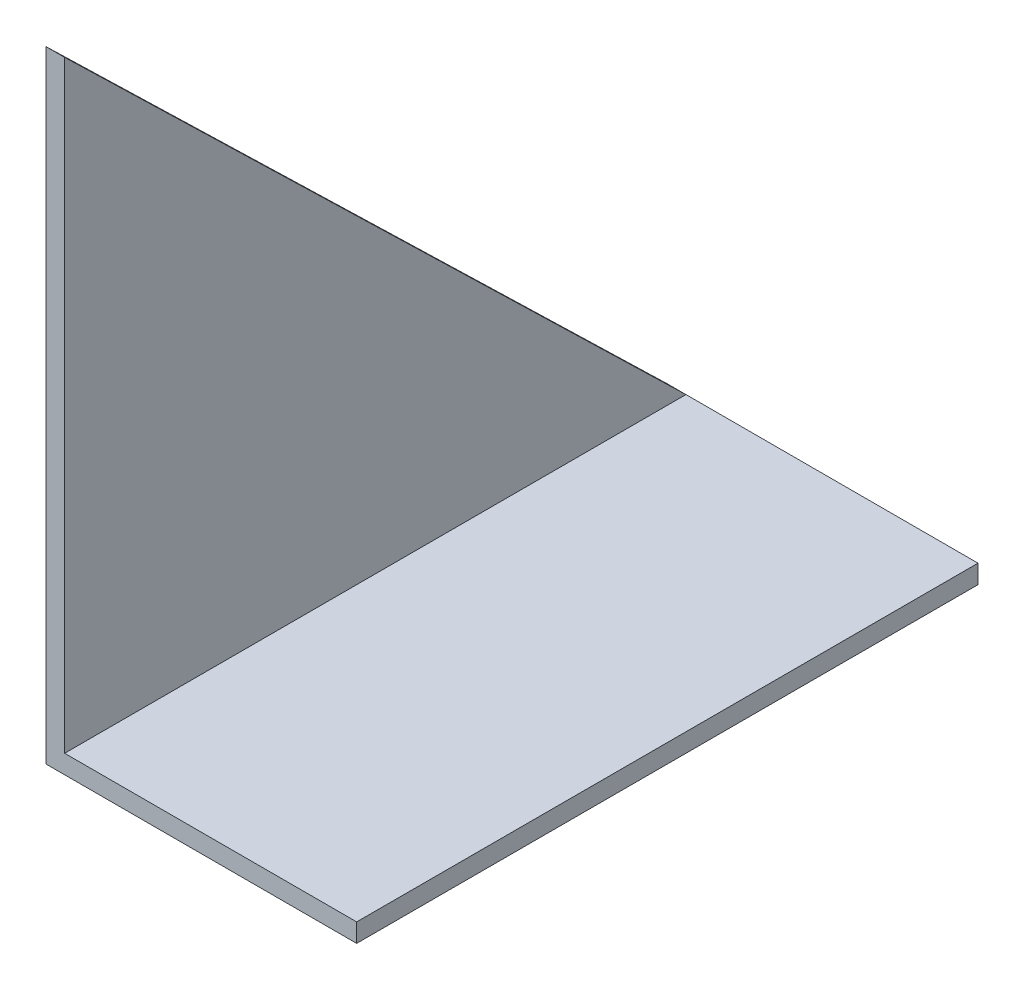
ISO-10303-21;
HEADER;
FILE_DESCRIPTION(('STEP AP214'),'2;1');
FILE_NAME('part.step','',(''),(''),'','','');
FILE_SCHEMA(('AUTOMOTIVE_DESIGN { 1 0 10303 214 1 1 1 1 }'));
ENDSEC;
DATA;
#1=APPLICATION_CONTEXT('core data for automotive mechanical design processes');
#2=APPLICATION_PROTOCOL_DEFINITION('international standard','automotive_design',2000,#1);
#3=PRODUCT_CONTEXT('',#1,'mechanical');
#4=PRODUCT('Part','Part','',(#3));
#5=PRODUCT_RELATED_PRODUCT_CATEGORY('part','',(#4));
#6=PRODUCT_DEFINITION_FORMATION('','',#4);
#7=PRODUCT_DEFINITION_CONTEXT('part definition',#1,'design');
#8=PRODUCT_DEFINITION('design','',#6,#7);
#9=PRODUCT_DEFINITION_SHAPE('','',#8);
#10=(LENGTH_UNIT() NAMED_UNIT(*) SI_UNIT(.MILLI.,.METRE.));
#11=(NAMED_UNIT(*) PLANE_ANGLE_UNIT() SI_UNIT($,.RADIAN.));
#12=(NAMED_UNIT(*) SI_UNIT($,.STERADIAN.) SOLID_ANGLE_UNIT());
#13=UNCERTAINTY_MEASURE_WITH_UNIT(LENGTH_MEASURE(1.E-05),#10,'distance_accuracy_value','');
#14=(GEOMETRIC_REPRESENTATION_CONTEXT(3) GLOBAL_UNCERTAINTY_ASSIGNED_CONTEXT((#13)) GLOBAL_UNIT_ASSIGNED_CONTEXT((#10,
#11,#12)) REPRESENTATION_CONTEXT('',''));
#15=CARTESIAN_POINT('',(0.,0.,0.));
#16=DIRECTION('',(0.,0.,1.));
#17=DIRECTION('',(1.,0.,0.));
#18=AXIS2_PLACEMENT_3D('',#15,#16,#17);
#19=CARTESIAN_POINT('',(-1.5,0.,50.));
#20=DIRECTION('',(-1.,0.,0.));
#21=DIRECTION('',(0.,0.,1.));
#22=AXIS2_PLACEMENT_3D('',#19,#20,#21);
#23=PLANE('',#22);
#24=DIRECTION('',(0.,0.696257929457928,0.717791679853534));
#25=VECTOR('',#24,1.);
#26=CARTESIAN_POINT('',(-1.5,25.7612447833479,25.0115925601525));
#27=LINE('',#26,#25);
#28=CARTESIAN_POINT('',(-1.5,-47.,-50.));
#29=VERTEX_POINT('',#28);
#30=CARTESIAN_POINT('',(-1.5,50.,50.));
#31=VERTEX_POINT('',#30);
#32=EDGE_CURVE('E101',#29,#31,#27,.T.);
#33=ORIENTED_EDGE('',*,*,#32,.F.);
#34=DIRECTION('',(0.,1.,0.));
#35=VECTOR('',#34,1.);
#36=CARTESIAN_POINT('',(-1.5,0.,-50.));
#37=LINE('',#36,#35);
#38=CARTESIAN_POINT('',(-1.5,-50.,-50.));
#39=VERTEX_POINT('',#38);
#40=EDGE_CURVE('E100',#39,#29,#37,.T.);
#41=ORIENTED_EDGE('',*,*,#40,.F.);
#42=DIRECTION('',(0.,0.,-1.));
#43=VECTOR('',#42,1.);
#44=CARTESIAN_POINT('',(-1.5,-50.,50.));
#45=LINE('',#44,#43);
#46=CARTESIAN_POINT('',(-1.5,-50.,50.));
#47=VERTEX_POINT('',#46);
#48=EDGE_CURVE('E44',#47,#39,#45,.T.);
#49=ORIENTED_EDGE('',*,*,#48,.F.);
#50=DIRECTION('',(0.,1.,0.));
#51=VECTOR('',#50,1.);
#52=CARTESIAN_POINT('',(-1.5,0.,50.));
#53=LINE('',#52,#51);
#54=EDGE_CURVE('E109',#47,#31,#53,.T.);
#55=ORIENTED_EDGE('',*,*,#54,.T.);
#56=EDGE_LOOP('',(#33,#41,#49,#55));
#57=FACE_BOUND('',#56,.T.);
#58=ADVANCED_FACE('F35',(#57),#23,.T.);
#59=CARTESIAN_POINT('',(0.,0.,-50.));
#60=DIRECTION('',(0.,0.,1.));
#61=DIRECTION('',(1.,0.,0.));
#62=AXIS2_PLACEMENT_3D('',#59,#60,#61);
#63=PLANE('',#62);
#64=ORIENTED_EDGE('',*,*,#40,.T.);
#65=DIRECTION('',(1.,0.,0.));
#66=VECTOR('',#65,1.);
#67=CARTESIAN_POINT('',(-98.5,-47.,-50.));
#68=LINE('',#67,#66);
#69=CARTESIAN_POINT('',(1.5,-47.,-50.));
#70=VERTEX_POINT('',#69);
#71=EDGE_CURVE('E77',#29,#70,#68,.T.);
#72=ORIENTED_EDGE('',*,*,#71,.T.);
#73=DIRECTION('',(1.,0.,0.));
#74=VECTOR('',#73,1.);
#75=CARTESIAN_POINT('',(1.5,-47.,-50.));
#76=LINE('',#75,#74);
#77=CARTESIAN_POINT('',(48.5,-47.,-50.));
#78=VERTEX_POINT('',#77);
#79=EDGE_CURVE('E118',#70,#78,#76,.T.);
#80=ORIENTED_EDGE('',*,*,#79,.T.);
#81=DIRECTION('',(0.,1.,0.));
#82=VECTOR('',#81,1.);
#83=CARTESIAN_POINT('',(48.5,-50.,-50.));
#84=LINE('',#83,#82);
#85=CARTESIAN_POINT('',(48.5,-50.,-50.));
#86=VERTEX_POINT('',#85);
#87=EDGE_CURVE('E108',#86,#78,#84,.T.);
#88=ORIENTED_EDGE('',*,*,#87,.F.);
#89=DIRECTION('',(-1.,0.,0.));
#90=VECTOR('',#89,1.);
#91=CARTESIAN_POINT('',(0.,-50.,-50.));
#92=LINE('',#91,#90);
#93=EDGE_CURVE('E94',#86,#39,#92,.T.);
#94=ORIENTED_EDGE('',*,*,#93,.T.);
#95=EDGE_LOOP('',(#64,#72,#80,#88,#94));
#96=FACE_BOUND('',#95,.T.);
#97=ADVANCED_FACE('F106',(#96),#63,.F.);
#98=CARTESIAN_POINT('',(0.,0.,50.));
#99=DIRECTION('',(0.,0.,1.));
#100=DIRECTION('',(1.,0.,0.));
#101=AXIS2_PLACEMENT_3D('',#98,#99,#100);
#102=PLANE('',#101);
#103=ORIENTED_EDGE('',*,*,#54,.F.);
#104=DIRECTION('',(-1.,0.,0.));
#105=VECTOR('',#104,1.);
#106=CARTESIAN_POINT('',(0.,-50.,50.));
#107=LINE('',#106,#105);
#108=CARTESIAN_POINT('',(48.5,-50.,50.));
#109=VERTEX_POINT('',#108);
#110=EDGE_CURVE('E96',#109,#47,#107,.T.);
#111=ORIENTED_EDGE('',*,*,#110,.F.);
#112=DIRECTION('',(0.,1.,0.));
#113=VECTOR('',#112,1.);
#114=CARTESIAN_POINT('',(48.5,-50.,50.));
#115=LINE('',#114,#113);
#116=CARTESIAN_POINT('',(48.5,-47.,50.));
#117=VERTEX_POINT('',#116);
#118=EDGE_CURVE('E116',#109,#117,#115,.T.);
#119=ORIENTED_EDGE('',*,*,#118,.T.);
#120=DIRECTION('',(1.,0.,0.));
#121=VECTOR('',#120,1.);
#122=CARTESIAN_POINT('',(1.5,-47.,50.));
#123=LINE('',#122,#121);
#124=CARTESIAN_POINT('',(1.5,-47.,50.));
#125=VERTEX_POINT('',#124);
#126=EDGE_CURVE('E114',#125,#117,#123,.T.);
#127=ORIENTED_EDGE('',*,*,#126,.F.);
#128=DIRECTION('',(0.,1.,0.));
#129=VECTOR('',#128,1.);
#130=CARTESIAN_POINT('',(1.5,0.,50.));
#131=LINE('',#130,#129);
#132=CARTESIAN_POINT('',(1.5,50.,50.));
#133=VERTEX_POINT('',#132);
#134=EDGE_CURVE('E129',#125,#133,#131,.T.);
#135=ORIENTED_EDGE('',*,*,#134,.T.);
#136=DIRECTION('',(-1.,0.,0.));
#137=VECTOR('',#136,1.);
#138=CARTESIAN_POINT('',(1.15648231731787E-13,50.,50.));
#139=LINE('',#138,#137);
#140=EDGE_CURVE('E97',#133,#31,#139,.T.);
#141=ORIENTED_EDGE('',*,*,#140,.T.);
#142=EDGE_LOOP('',(#103,#111,#119,#127,#135,#141));
#143=FACE_BOUND('',#142,.T.);
#144=ADVANCED_FACE('F125',(#143),#102,.T.);
#145=CARTESIAN_POINT('',(1.5,0.,50.));
#146=DIRECTION('',(-1.,0.,0.));
#147=DIRECTION('',(0.,0.,1.));
#148=AXIS2_PLACEMENT_3D('',#145,#146,#147);
#149=PLANE('',#148);
#150=DIRECTION('',(0.,0.,-1.));
#151=VECTOR('',#150,1.);
#152=CARTESIAN_POINT('',(1.5,-47.,50.));
#153=LINE('',#152,#151);
#154=EDGE_CURVE('E11',#125,#70,#153,.T.);
#155=ORIENTED_EDGE('',*,*,#154,.T.);
#156=DIRECTION('',(0.,-0.696257929457928,-0.717791679853534));
#157=VECTOR('',#156,1.);
#158=CARTESIAN_POINT('',(1.5,0.772837343500433,-0.74965222319542));
#159=LINE('',#158,#157);
#160=EDGE_CURVE('E135',#133,#70,#159,.T.);
#161=ORIENTED_EDGE('',*,*,#160,.F.);
#162=ORIENTED_EDGE('',*,*,#134,.F.);
#163=EDGE_LOOP('',(#155,#161,#162));
#164=FACE_BOUND('',#163,.T.);
#165=ADVANCED_FACE('F137',(#164),#149,.F.);
#166=CARTESIAN_POINT('',(0.,-50.,50.));
#167=DIRECTION('',(0.,-1.,0.));
#168=DIRECTION('',(0.,0.,-1.));
#169=AXIS2_PLACEMENT_3D('',#166,#167,#168);
#170=PLANE('',#169);
#171=ORIENTED_EDGE('',*,*,#93,.F.);
#172=DIRECTION('',(0.,0.,-1.));
#173=VECTOR('',#172,1.);
#174=CARTESIAN_POINT('',(48.5,-50.,50.));
#175=LINE('',#174,#173);
#176=EDGE_CURVE('E103',#109,#86,#175,.T.);
#177=ORIENTED_EDGE('',*,*,#176,.F.);
#178=ORIENTED_EDGE('',*,*,#110,.T.);
#179=ORIENTED_EDGE('',*,*,#48,.T.);
#180=EDGE_LOOP('',(#171,#177,#178,#179));
#181=FACE_BOUND('',#180,.T.);
#182=ADVANCED_FACE('F91',(#181),#170,.T.);
#183=CARTESIAN_POINT('',(48.5,-50.,50.));
#184=DIRECTION('',(-1.,0.,0.));
#185=DIRECTION('',(0.,0.,1.));
#186=AXIS2_PLACEMENT_3D('',#183,#184,#185);
#187=PLANE('',#186);
#188=ORIENTED_EDGE('',*,*,#87,.T.);
#189=DIRECTION('',(0.,0.,-1.));
#190=VECTOR('',#189,1.);
#191=CARTESIAN_POINT('',(48.5,-47.,50.));
#192=LINE('',#191,#190);
#193=EDGE_CURVE('E67',#117,#78,#192,.T.);
#194=ORIENTED_EDGE('',*,*,#193,.F.);
#195=ORIENTED_EDGE('',*,*,#118,.F.);
#196=ORIENTED_EDGE('',*,*,#176,.T.);
#197=EDGE_LOOP('',(#188,#194,#195,#196));
#198=FACE_BOUND('',#197,.T.);
#199=ADVANCED_FACE('F123',(#198),#187,.F.);
#200=CARTESIAN_POINT('',(1.5,-47.,50.));
#201=DIRECTION('',(0.,1.,0.));
#202=DIRECTION('',(-1.,0.,0.));
#203=AXIS2_PLACEMENT_3D('',#200,#201,#202);
#204=PLANE('',#203);
#205=ORIENTED_EDGE('',*,*,#79,.F.);
#206=ORIENTED_EDGE('',*,*,#154,.F.);
#207=ORIENTED_EDGE('',*,*,#126,.T.);
#208=ORIENTED_EDGE('',*,*,#193,.T.);
#209=EDGE_LOOP('',(#205,#206,#207,#208));
#210=FACE_BOUND('',#209,.T.);
#211=ADVANCED_FACE('F37',(#210),#204,.T.);
#212=CARTESIAN_POINT('',(-98.5,0.772837343500433,-0.74965222319542));
#213=DIRECTION('',(0.,-0.717791679853534,0.696257929457928));
#214=DIRECTION('',(0.,-0.696257929457928,-0.717791679853534));
#215=AXIS2_PLACEMENT_3D('',#212,#213,#214);
#216=PLANE('',#215);
#217=ORIENTED_EDGE('',*,*,#32,.T.);
#218=ORIENTED_EDGE('',*,*,#140,.F.);
#219=ORIENTED_EDGE('',*,*,#160,.T.);
#220=ORIENTED_EDGE('',*,*,#71,.F.);
#221=EDGE_LOOP('',(#217,#218,#219,#220));
#222=FACE_BOUND('',#221,.T.);
#223=ADVANCED_FACE('F134',(#222),#216,.F.);
#224=CLOSED_SHELL('',(#58,#97,#144,#165,#182,#199,#211,#223));
#225=MANIFOLD_SOLID_BREP('B2',#224);
#226=ADVANCED_BREP_SHAPE_REPRESENTATION('',(#18,#225),#14);
#227=SHAPE_DEFINITION_REPRESENTATION(#9,#226);
ENDSEC;
END-ISO-10303-21;
